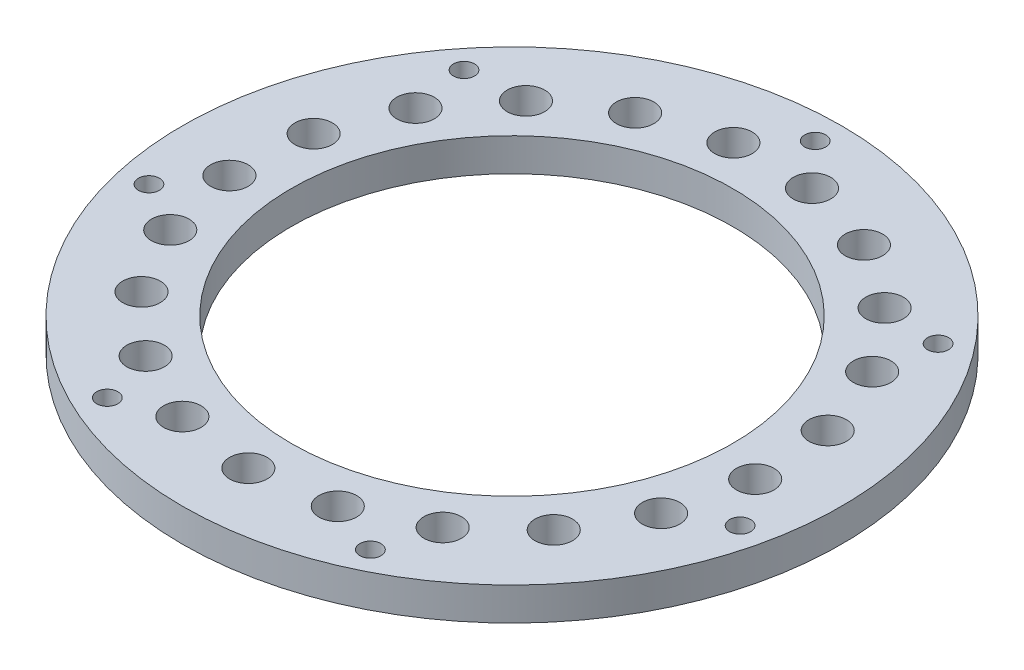
ISO-10303-21;
HEADER;
FILE_DESCRIPTION(('STEP AP214'),'2;1');
FILE_NAME('part.step','',(''),(''),'','','');
FILE_SCHEMA(('AUTOMOTIVE_DESIGN { 1 0 10303 214 1 1 1 1 }'));
ENDSEC;
DATA;
#1=APPLICATION_CONTEXT('core data for automotive mechanical design processes');
#2=APPLICATION_PROTOCOL_DEFINITION('international standard','automotive_design',2000,#1);
#3=PRODUCT_CONTEXT('',#1,'mechanical');
#4=PRODUCT('Part','Part','',(#3));
#5=PRODUCT_RELATED_PRODUCT_CATEGORY('part','',(#4));
#6=PRODUCT_DEFINITION_FORMATION('','',#4);
#7=PRODUCT_DEFINITION_CONTEXT('part definition',#1,'design');
#8=PRODUCT_DEFINITION('design','',#6,#7);
#9=PRODUCT_DEFINITION_SHAPE('','',#8);
#10=(LENGTH_UNIT() NAMED_UNIT(*) SI_UNIT(.MILLI.,.METRE.));
#11=(NAMED_UNIT(*) PLANE_ANGLE_UNIT() SI_UNIT($,.RADIAN.));
#12=(NAMED_UNIT(*) SI_UNIT($,.STERADIAN.) SOLID_ANGLE_UNIT());
#13=UNCERTAINTY_MEASURE_WITH_UNIT(LENGTH_MEASURE(1.E-05),#10,'distance_accuracy_value','');
#14=(GEOMETRIC_REPRESENTATION_CONTEXT(3) GLOBAL_UNCERTAINTY_ASSIGNED_CONTEXT((#13)) GLOBAL_UNIT_ASSIGNED_CONTEXT((#10,
#11,#12)) REPRESENTATION_CONTEXT('',''));
#15=CARTESIAN_POINT('',(0.,0.,0.));
#16=DIRECTION('',(0.,0.,1.));
#17=DIRECTION('',(1.,0.,0.));
#18=AXIS2_PLACEMENT_3D('',#15,#16,#17);
#19=CARTESIAN_POINT('',(0.,5.,0.));
#20=DIRECTION('',(0.,1.,0.));
#21=DIRECTION('',(0.,0.,1.));
#22=AXIS2_PLACEMENT_3D('',#19,#20,#21);
#23=PLANE('',#22);
#24=CARTESIAN_POINT('',(-11.7902069764356,5.,38.2229122314458));
#25=DIRECTION('',(0.,1.,0.));
#26=DIRECTION('',(0.,0.,1.));
#27=AXIS2_PLACEMENT_3D('',#24,#25,#26);
#28=CIRCLE('',#27,2.85);
#29=CARTESIAN_POINT('',(-11.7902069764356,5.,41.0729122314458));
#30=VERTEX_POINT('',#29);
#31=EDGE_CURVE('E222',#30,#30,#28,.T.);
#32=ORIENTED_EDGE('',*,*,#31,.F.);
#33=EDGE_LOOP('',(#32));
#34=FACE_BOUND('',#33,.T.);
#35=CARTESIAN_POINT('',(-22.5328023225445,5.,33.0495509726401));
#36=DIRECTION('',(0.,1.,0.));
#37=DIRECTION('',(0.,0.,1.));
#38=AXIS2_PLACEMENT_3D('',#35,#36,#37);
#39=CIRCLE('',#38,2.85);
#40=CARTESIAN_POINT('',(-22.5328023225445,5.,35.8995509726401));
#41=VERTEX_POINT('',#40);
#42=EDGE_CURVE('E216',#41,#41,#39,.T.);
#43=ORIENTED_EDGE('',*,*,#42,.F.);
#44=EDGE_LOOP('',(#43));
#45=FACE_BOUND('',#44,.T.);
#46=CARTESIAN_POINT('',(-31.2732592987209,5.,24.9395920743497));
#47=DIRECTION('',(0.,1.,0.));
#48=DIRECTION('',(0.,0.,1.));
#49=AXIS2_PLACEMENT_3D('',#46,#47,#48);
#50=CIRCLE('',#49,2.85);
#51=CARTESIAN_POINT('',(-31.2732592987209,5.,27.7895920743497));
#52=VERTEX_POINT('',#51);
#53=EDGE_CURVE('E210',#52,#52,#50,.T.);
#54=ORIENTED_EDGE('',*,*,#53,.F.);
#55=EDGE_LOOP('',(#54));
#56=FACE_BOUND('',#55,.T.);
#57=CARTESIAN_POINT('',(-37.234949945768,5.,14.6136409746562));
#58=DIRECTION('',(0.,1.,0.));
#59=DIRECTION('',(0.,0.,1.));
#60=AXIS2_PLACEMENT_3D('',#57,#58,#59);
#61=CIRCLE('',#60,2.85);
#62=CARTESIAN_POINT('',(-37.234949945768,5.,17.4636409746562));
#63=VERTEX_POINT('',#62);
#64=EDGE_CURVE('E204',#63,#63,#61,.T.);
#65=ORIENTED_EDGE('',*,*,#64,.F.);
#66=EDGE_LOOP('',(#65));
#67=FACE_BOUND('',#66,.T.);
#68=CARTESIAN_POINT('',(-39.8881518872472,5.,2.9892037434574));
#69=DIRECTION('',(0.,1.,0.));
#70=DIRECTION('',(0.,0.,1.));
#71=AXIS2_PLACEMENT_3D('',#68,#69,#70);
#72=CIRCLE('',#71,2.85);
#73=CARTESIAN_POINT('',(-39.8881518872472,5.,5.8392037434574));
#74=VERTEX_POINT('',#73);
#75=EDGE_CURVE('E198',#74,#74,#72,.T.);
#76=ORIENTED_EDGE('',*,*,#75,.F.);
#77=EDGE_LOOP('',(#76));
#78=FACE_BOUND('',#77,.T.);
#79=CARTESIAN_POINT('',(-38.997116487273,5.,-8.90083735825217));
#80=DIRECTION('',(0.,1.,0.));
#81=DIRECTION('',(0.,0.,1.));
#82=AXIS2_PLACEMENT_3D('',#79,#80,#81);
#83=CIRCLE('',#82,2.85);
#84=CARTESIAN_POINT('',(-38.997116487273,5.,-6.05083735825217));
#85=VERTEX_POINT('',#84);
#86=EDGE_CURVE('E192',#85,#85,#83,.T.);
#87=ORIENTED_EDGE('',*,*,#86,.F.);
#88=EDGE_LOOP('',(#87));
#89=FACE_BOUND('',#88,.T.);
#90=CARTESIAN_POINT('',(-34.6410161513777,5.,-19.9999999999997));
#91=DIRECTION('',(0.,1.,0.));
#92=DIRECTION('',(0.,0.,1.));
#93=AXIS2_PLACEMENT_3D('',#90,#91,#92);
#94=CIRCLE('',#93,2.85);
#95=CARTESIAN_POINT('',(-34.6410161513777,5.,-17.1499999999997));
#96=VERTEX_POINT('',#95);
#97=EDGE_CURVE('E186',#96,#96,#94,.T.);
#98=ORIENTED_EDGE('',*,*,#97,.F.);
#99=EDGE_LOOP('',(#98));
#100=FACE_BOUND('',#99,.T.);
#101=CARTESIAN_POINT('',(-27.206909510837,5.,-29.3220748731928));
#102=DIRECTION('',(0.,1.,0.));
#103=DIRECTION('',(0.,0.,1.));
#104=AXIS2_PLACEMENT_3D('',#101,#102,#103);
#105=CIRCLE('',#104,2.85);
#106=CARTESIAN_POINT('',(-27.206909510837,5.,-26.4720748731928));
#107=VERTEX_POINT('',#106);
#108=EDGE_CURVE('E180',#107,#107,#105,.T.);
#109=ORIENTED_EDGE('',*,*,#108,.F.);
#110=EDGE_LOOP('',(#109));
#111=FACE_BOUND('',#110,.T.);
#112=CARTESIAN_POINT('',(-17.3553495647026,5.,-36.0387547160966));
#113=DIRECTION('',(0.,1.,0.));
#114=DIRECTION('',(0.,0.,1.));
#115=AXIS2_PLACEMENT_3D('',#112,#113,#114);
#116=CIRCLE('',#115,2.85);
#117=CARTESIAN_POINT('',(-17.3553495647026,5.,-33.1887547160966));
#118=VERTEX_POINT('',#117);
#119=EDGE_CURVE('E174',#118,#118,#116,.T.);
#120=ORIENTED_EDGE('',*,*,#119,.F.);
#121=EDGE_LOOP('',(#120));
#122=FACE_BOUND('',#121,.T.);
#123=CARTESIAN_POINT('',(-5.96169064704728,5.,-39.5532330490051));
#124=DIRECTION('',(0.,1.,0.));
#125=DIRECTION('',(0.,0.,1.));
#126=AXIS2_PLACEMENT_3D('',#123,#124,#125);
#127=CIRCLE('',#126,2.85);
#128=CARTESIAN_POINT('',(-5.96169064704728,5.,-36.7032330490051));
#129=VERTEX_POINT('',#128);
#130=EDGE_CURVE('E168',#129,#129,#127,.T.);
#131=ORIENTED_EDGE('',*,*,#130,.F.);
#132=EDGE_LOOP('',(#131));
#133=FACE_BOUND('',#132,.T.);
#134=CARTESIAN_POINT('',(5.96169064704671,5.,-39.5532330490052));
#135=DIRECTION('',(0.,1.,0.));
#136=DIRECTION('',(0.,0.,1.));
#137=AXIS2_PLACEMENT_3D('',#134,#135,#136);
#138=CIRCLE('',#137,2.85);
#139=CARTESIAN_POINT('',(5.96169064704671,5.,-36.7032330490052));
#140=VERTEX_POINT('',#139);
#141=EDGE_CURVE('E162',#140,#140,#138,.T.);
#142=ORIENTED_EDGE('',*,*,#141,.F.);
#143=EDGE_LOOP('',(#142));
#144=FACE_BOUND('',#143,.T.);
#145=CARTESIAN_POINT('',(17.3553495647021,5.,-36.0387547160969));
#146=DIRECTION('',(0.,1.,0.));
#147=DIRECTION('',(0.,0.,1.));
#148=AXIS2_PLACEMENT_3D('',#145,#146,#147);
#149=CIRCLE('',#148,2.85);
#150=CARTESIAN_POINT('',(17.3553495647021,5.,-33.1887547160969));
#151=VERTEX_POINT('',#150);
#152=EDGE_CURVE('E156',#151,#151,#149,.T.);
#153=ORIENTED_EDGE('',*,*,#152,.F.);
#154=EDGE_LOOP('',(#153));
#155=FACE_BOUND('',#154,.T.);
#156=CARTESIAN_POINT('',(27.2069095108366,5.,-29.3220748731932));
#157=DIRECTION('',(0.,1.,0.));
#158=DIRECTION('',(0.,0.,1.));
#159=AXIS2_PLACEMENT_3D('',#156,#157,#158);
#160=CIRCLE('',#159,2.85);
#161=CARTESIAN_POINT('',(27.2069095108366,5.,-26.4720748731932));
#162=VERTEX_POINT('',#161);
#163=EDGE_CURVE('E150',#162,#162,#160,.T.);
#164=ORIENTED_EDGE('',*,*,#163,.F.);
#165=EDGE_LOOP('',(#164));
#166=FACE_BOUND('',#165,.T.);
#167=CARTESIAN_POINT('',(34.6410161513775,5.,-20.0000000000002));
#168=DIRECTION('',(0.,1.,0.));
#169=DIRECTION('',(0.,0.,1.));
#170=AXIS2_PLACEMENT_3D('',#167,#168,#169);
#171=CIRCLE('',#170,2.85);
#172=CARTESIAN_POINT('',(34.6410161513775,5.,-17.1500000000002));
#173=VERTEX_POINT('',#172);
#174=EDGE_CURVE('E144',#173,#173,#171,.T.);
#175=ORIENTED_EDGE('',*,*,#174,.F.);
#176=EDGE_LOOP('',(#175));
#177=FACE_BOUND('',#176,.T.);
#178=CARTESIAN_POINT('',(38.9971164872729,5.,-8.90083735825273));
#179=DIRECTION('',(0.,1.,0.));
#180=DIRECTION('',(0.,0.,1.));
#181=AXIS2_PLACEMENT_3D('',#178,#179,#180);
#182=CIRCLE('',#181,2.85);
#183=CARTESIAN_POINT('',(38.9971164872729,5.,-6.05083735825273));
#184=VERTEX_POINT('',#183);
#185=EDGE_CURVE('E138',#184,#184,#182,.T.);
#186=ORIENTED_EDGE('',*,*,#185,.F.);
#187=EDGE_LOOP('',(#186));
#188=FACE_BOUND('',#187,.T.);
#189=CARTESIAN_POINT('',(39.8881518872472,5.,2.98920374345683));
#190=DIRECTION('',(0.,1.,0.));
#191=DIRECTION('',(0.,0.,1.));
#192=AXIS2_PLACEMENT_3D('',#189,#190,#191);
#193=CIRCLE('',#192,2.85);
#194=CARTESIAN_POINT('',(39.8881518872472,5.,5.83920374345683));
#195=VERTEX_POINT('',#194);
#196=EDGE_CURVE('E132',#195,#195,#193,.T.);
#197=ORIENTED_EDGE('',*,*,#196,.F.);
#198=EDGE_LOOP('',(#197));
#199=FACE_BOUND('',#198,.T.);
#200=CARTESIAN_POINT('',(37.2349499457682,5.,14.6136409746557));
#201=DIRECTION('',(0.,1.,0.));
#202=DIRECTION('',(0.,0.,1.));
#203=AXIS2_PLACEMENT_3D('',#200,#201,#202);
#204=CIRCLE('',#203,2.85);
#205=CARTESIAN_POINT('',(37.2349499457682,5.,17.4636409746557));
#206=VERTEX_POINT('',#205);
#207=EDGE_CURVE('E126',#206,#206,#204,.T.);
#208=ORIENTED_EDGE('',*,*,#207,.F.);
#209=EDGE_LOOP('',(#208));
#210=FACE_BOUND('',#209,.T.);
#211=CARTESIAN_POINT('',(31.2732592987212,5.,24.9395920743493));
#212=DIRECTION('',(0.,1.,0.));
#213=DIRECTION('',(0.,0.,1.));
#214=AXIS2_PLACEMENT_3D('',#211,#212,#213);
#215=CIRCLE('',#214,2.85);
#216=CARTESIAN_POINT('',(31.2732592987212,5.,27.7895920743493));
#217=VERTEX_POINT('',#216);
#218=EDGE_CURVE('E120',#217,#217,#215,.T.);
#219=ORIENTED_EDGE('',*,*,#218,.F.);
#220=EDGE_LOOP('',(#219));
#221=FACE_BOUND('',#220,.T.);
#222=CARTESIAN_POINT('',(22.5328023225449,5.,33.0495509726398));
#223=DIRECTION('',(0.,1.,0.));
#224=DIRECTION('',(0.,0.,1.));
#225=AXIS2_PLACEMENT_3D('',#222,#223,#224);
#226=CIRCLE('',#225,2.85);
#227=CARTESIAN_POINT('',(22.5328023225449,5.,35.8995509726398));
#228=VERTEX_POINT('',#227);
#229=EDGE_CURVE('E114',#228,#228,#226,.T.);
#230=ORIENTED_EDGE('',*,*,#229,.F.);
#231=EDGE_LOOP('',(#230));
#232=FACE_BOUND('',#231,.T.);
#233=CARTESIAN_POINT('',(11.7902069764362,5.,38.2229122314456));
#234=DIRECTION('',(0.,1.,0.));
#235=DIRECTION('',(0.,0.,1.));
#236=AXIS2_PLACEMENT_3D('',#233,#234,#235);
#237=CIRCLE('',#236,2.85);
#238=CARTESIAN_POINT('',(11.7902069764362,5.,41.0729122314456));
#239=VERTEX_POINT('',#238);
#240=EDGE_CURVE('E108',#239,#239,#237,.T.);
#241=ORIENTED_EDGE('',*,*,#240,.F.);
#242=EDGE_LOOP('',(#241));
#243=FACE_BOUND('',#242,.T.);
#244=CARTESIAN_POINT('',(0.,5.,40.));
#245=DIRECTION('',(0.,1.,0.));
#246=DIRECTION('',(0.,0.,1.));
#247=AXIS2_PLACEMENT_3D('',#244,#245,#246);
#248=CIRCLE('',#247,2.85);
#249=CARTESIAN_POINT('',(0.,5.,42.85));
#250=VERTEX_POINT('',#249);
#251=EDGE_CURVE('E102',#250,#250,#248,.T.);
#252=ORIENTED_EDGE('',*,*,#251,.F.);
#253=EDGE_LOOP('',(#252));
#254=FACE_BOUND('',#253,.T.);
#255=CARTESIAN_POINT('',(35.964248193529,5.,-28.6805308855022));
#256=DIRECTION('',(0.,1.,0.));
#257=DIRECTION('',(0.,0.,1.));
#258=AXIS2_PLACEMENT_3D('',#255,#256,#257);
#259=CIRCLE('',#258,1.59999999999999);
#260=CARTESIAN_POINT('',(35.964248193529,5.,-27.0805308855022));
#261=VERTEX_POINT('',#260);
#262=EDGE_CURVE('E96',#261,#261,#259,.T.);
#263=ORIENTED_EDGE('',*,*,#262,.F.);
#264=EDGE_LOOP('',(#263));
#265=FACE_BOUND('',#264,.T.);
#266=CARTESIAN_POINT('',(44.846683960364,5.,10.23596296199));
#267=DIRECTION('',(0.,1.,0.));
#268=DIRECTION('',(0.,0.,1.));
#269=AXIS2_PLACEMENT_3D('',#266,#267,#268);
#270=CIRCLE('',#269,1.59999999999999);
#271=CARTESIAN_POINT('',(44.846683960364,5.,11.83596296199));
#272=VERTEX_POINT('',#271);
#273=EDGE_CURVE('E90',#272,#272,#270,.T.);
#274=ORIENTED_EDGE('',*,*,#273,.F.);
#275=EDGE_LOOP('',(#274));
#276=FACE_BOUND('',#275,.T.);
#277=CARTESIAN_POINT('',(19.958651999408,5.,41.4445679235111));
#278=DIRECTION('',(0.,1.,0.));
#279=DIRECTION('',(0.,0.,1.));
#280=AXIS2_PLACEMENT_3D('',#277,#278,#279);
#281=CIRCLE('',#280,1.59999999999999);
#282=CARTESIAN_POINT('',(19.958651999408,5.,43.0445679235111));
#283=VERTEX_POINT('',#282);
#284=EDGE_CURVE('E84',#283,#283,#281,.T.);
#285=ORIENTED_EDGE('',*,*,#284,.F.);
#286=EDGE_LOOP('',(#285));
#287=FACE_BOUND('',#286,.T.);
#288=CARTESIAN_POINT('',(-19.9586519994074,5.,41.4445679235114));
#289=DIRECTION('',(0.,1.,0.));
#290=DIRECTION('',(0.,0.,1.));
#291=AXIS2_PLACEMENT_3D('',#288,#289,#290);
#292=CIRCLE('',#291,1.59999999999999);
#293=CARTESIAN_POINT('',(-19.9586519994074,5.,43.0445679235114));
#294=VERTEX_POINT('',#293);
#295=EDGE_CURVE('E78',#294,#294,#292,.T.);
#296=ORIENTED_EDGE('',*,*,#295,.F.);
#297=EDGE_LOOP('',(#296));
#298=FACE_BOUND('',#297,.T.);
#299=CARTESIAN_POINT('',(-44.8466839603638,5.,10.2359629619906));
#300=DIRECTION('',(0.,1.,0.));
#301=DIRECTION('',(0.,0.,1.));
#302=AXIS2_PLACEMENT_3D('',#299,#300,#301);
#303=CIRCLE('',#302,1.59999999999999);
#304=CARTESIAN_POINT('',(-44.8466839603638,5.,11.8359629619906));
#305=VERTEX_POINT('',#304);
#306=EDGE_CURVE('E72',#305,#305,#303,.T.);
#307=ORIENTED_EDGE('',*,*,#306,.F.);
#308=EDGE_LOOP('',(#307));
#309=FACE_BOUND('',#308,.T.);
#310=CARTESIAN_POINT('',(-35.9642481935294,5.,-28.6805308855017));
#311=DIRECTION('',(0.,1.,0.));
#312=DIRECTION('',(0.,0.,1.));
#313=AXIS2_PLACEMENT_3D('',#310,#311,#312);
#314=CIRCLE('',#313,1.59999999999998);
#315=CARTESIAN_POINT('',(-35.9642481935294,5.,-27.0805308855017));
#316=VERTEX_POINT('',#315);
#317=EDGE_CURVE('E66',#316,#316,#314,.T.);
#318=ORIENTED_EDGE('',*,*,#317,.F.);
#319=EDGE_LOOP('',(#318));
#320=FACE_BOUND('',#319,.T.);
#321=CARTESIAN_POINT('',(0.,5.,-46.));
#322=DIRECTION('',(0.,1.,0.));
#323=DIRECTION('',(0.,0.,1.));
#324=AXIS2_PLACEMENT_3D('',#321,#322,#323);
#325=CIRCLE('',#324,1.59999999999999);
#326=CARTESIAN_POINT('',(0.,5.,-44.4));
#327=VERTEX_POINT('',#326);
#328=EDGE_CURVE('E60',#327,#327,#325,.T.);
#329=ORIENTED_EDGE('',*,*,#328,.F.);
#330=EDGE_LOOP('',(#329));
#331=FACE_BOUND('',#330,.T.);
#332=CARTESIAN_POINT('',(0.,5.,0.));
#333=DIRECTION('',(0.,1.,0.));
#334=DIRECTION('',(0.,0.,1.));
#335=AXIS2_PLACEMENT_3D('',#332,#333,#334);
#336=CIRCLE('',#335,50.);
#337=CARTESIAN_POINT('',(0.,5.,50.));
#338=VERTEX_POINT('',#337);
#339=EDGE_CURVE('E10',#338,#338,#336,.T.);
#340=ORIENTED_EDGE('',*,*,#339,.T.);
#341=EDGE_LOOP('',(#340));
#342=FACE_BOUND('',#341,.T.);
#343=CARTESIAN_POINT('',(0.,5.,0.));
#344=DIRECTION('',(0.,1.,0.));
#345=DIRECTION('',(0.,0.,1.));
#346=AXIS2_PLACEMENT_3D('',#343,#344,#345);
#347=CIRCLE('',#346,33.5);
#348=CARTESIAN_POINT('',(0.,5.,33.5));
#349=VERTEX_POINT('',#348);
#350=EDGE_CURVE('E50',#349,#349,#347,.T.);
#351=ORIENTED_EDGE('',*,*,#350,.F.);
#352=EDGE_LOOP('',(#351));
#353=FACE_BOUND('',#352,.T.);
#354=ADVANCED_FACE('F39',(#34,#45,#56,#67,#78,#89,#100,#111,#122,#133,#144,#155,#166,#177,#188,
#199,#210,#221,#232,#243,#254,#265,#276,#287,#298,#309,#320,#331,#342,#353),#23,.T.);
#355=CARTESIAN_POINT('',(0.,0.,0.));
#356=DIRECTION('',(0.,1.,0.));
#357=DIRECTION('',(0.,0.,1.));
#358=AXIS2_PLACEMENT_3D('',#355,#356,#357);
#359=PLANE('',#358);
#360=CARTESIAN_POINT('',(-11.7902069764356,0.,38.2229122314458));
#361=DIRECTION('',(0.,1.,0.));
#362=DIRECTION('',(0.,0.,1.));
#363=AXIS2_PLACEMENT_3D('',#360,#361,#362);
#364=CIRCLE('',#363,2.85);
#365=CARTESIAN_POINT('',(-11.7902069764356,0.,41.0729122314458));
#366=VERTEX_POINT('',#365);
#367=EDGE_CURVE('E219',#366,#366,#364,.T.);
#368=ORIENTED_EDGE('',*,*,#367,.T.);
#369=EDGE_LOOP('',(#368));
#370=FACE_BOUND('',#369,.T.);
#371=CARTESIAN_POINT('',(-22.5328023225445,0.,33.0495509726401));
#372=DIRECTION('',(0.,1.,0.));
#373=DIRECTION('',(0.,0.,1.));
#374=AXIS2_PLACEMENT_3D('',#371,#372,#373);
#375=CIRCLE('',#374,2.85);
#376=CARTESIAN_POINT('',(-22.5328023225445,0.,35.8995509726401));
#377=VERTEX_POINT('',#376);
#378=EDGE_CURVE('E213',#377,#377,#375,.T.);
#379=ORIENTED_EDGE('',*,*,#378,.T.);
#380=EDGE_LOOP('',(#379));
#381=FACE_BOUND('',#380,.T.);
#382=CARTESIAN_POINT('',(-31.2732592987209,0.,24.9395920743497));
#383=DIRECTION('',(0.,1.,0.));
#384=DIRECTION('',(0.,0.,1.));
#385=AXIS2_PLACEMENT_3D('',#382,#383,#384);
#386=CIRCLE('',#385,2.85);
#387=CARTESIAN_POINT('',(-31.2732592987209,0.,27.7895920743497));
#388=VERTEX_POINT('',#387);
#389=EDGE_CURVE('E207',#388,#388,#386,.T.);
#390=ORIENTED_EDGE('',*,*,#389,.T.);
#391=EDGE_LOOP('',(#390));
#392=FACE_BOUND('',#391,.T.);
#393=CARTESIAN_POINT('',(-37.234949945768,0.,14.6136409746562));
#394=DIRECTION('',(0.,1.,0.));
#395=DIRECTION('',(0.,0.,1.));
#396=AXIS2_PLACEMENT_3D('',#393,#394,#395);
#397=CIRCLE('',#396,2.85);
#398=CARTESIAN_POINT('',(-37.234949945768,0.,17.4636409746562));
#399=VERTEX_POINT('',#398);
#400=EDGE_CURVE('E201',#399,#399,#397,.T.);
#401=ORIENTED_EDGE('',*,*,#400,.T.);
#402=EDGE_LOOP('',(#401));
#403=FACE_BOUND('',#402,.T.);
#404=CARTESIAN_POINT('',(-39.8881518872472,0.,2.9892037434574));
#405=DIRECTION('',(0.,1.,0.));
#406=DIRECTION('',(0.,0.,1.));
#407=AXIS2_PLACEMENT_3D('',#404,#405,#406);
#408=CIRCLE('',#407,2.85);
#409=CARTESIAN_POINT('',(-39.8881518872472,0.,5.8392037434574));
#410=VERTEX_POINT('',#409);
#411=EDGE_CURVE('E195',#410,#410,#408,.T.);
#412=ORIENTED_EDGE('',*,*,#411,.T.);
#413=EDGE_LOOP('',(#412));
#414=FACE_BOUND('',#413,.T.);
#415=CARTESIAN_POINT('',(-38.997116487273,0.,-8.90083735825217));
#416=DIRECTION('',(0.,1.,0.));
#417=DIRECTION('',(0.,0.,1.));
#418=AXIS2_PLACEMENT_3D('',#415,#416,#417);
#419=CIRCLE('',#418,2.85);
#420=CARTESIAN_POINT('',(-38.997116487273,0.,-6.05083735825217));
#421=VERTEX_POINT('',#420);
#422=EDGE_CURVE('E189',#421,#421,#419,.T.);
#423=ORIENTED_EDGE('',*,*,#422,.T.);
#424=EDGE_LOOP('',(#423));
#425=FACE_BOUND('',#424,.T.);
#426=CARTESIAN_POINT('',(-34.6410161513777,0.,-19.9999999999997));
#427=DIRECTION('',(0.,1.,0.));
#428=DIRECTION('',(0.,0.,1.));
#429=AXIS2_PLACEMENT_3D('',#426,#427,#428);
#430=CIRCLE('',#429,2.85);
#431=CARTESIAN_POINT('',(-34.6410161513777,0.,-17.1499999999997));
#432=VERTEX_POINT('',#431);
#433=EDGE_CURVE('E183',#432,#432,#430,.T.);
#434=ORIENTED_EDGE('',*,*,#433,.T.);
#435=EDGE_LOOP('',(#434));
#436=FACE_BOUND('',#435,.T.);
#437=CARTESIAN_POINT('',(-27.206909510837,0.,-29.3220748731928));
#438=DIRECTION('',(0.,1.,0.));
#439=DIRECTION('',(0.,0.,1.));
#440=AXIS2_PLACEMENT_3D('',#437,#438,#439);
#441=CIRCLE('',#440,2.85);
#442=CARTESIAN_POINT('',(-27.206909510837,0.,-26.4720748731928));
#443=VERTEX_POINT('',#442);
#444=EDGE_CURVE('E177',#443,#443,#441,.T.);
#445=ORIENTED_EDGE('',*,*,#444,.T.);
#446=EDGE_LOOP('',(#445));
#447=FACE_BOUND('',#446,.T.);
#448=CARTESIAN_POINT('',(-17.3553495647026,0.,-36.0387547160966));
#449=DIRECTION('',(0.,1.,0.));
#450=DIRECTION('',(0.,0.,1.));
#451=AXIS2_PLACEMENT_3D('',#448,#449,#450);
#452=CIRCLE('',#451,2.85);
#453=CARTESIAN_POINT('',(-17.3553495647026,0.,-33.1887547160966));
#454=VERTEX_POINT('',#453);
#455=EDGE_CURVE('E171',#454,#454,#452,.T.);
#456=ORIENTED_EDGE('',*,*,#455,.T.);
#457=EDGE_LOOP('',(#456));
#458=FACE_BOUND('',#457,.T.);
#459=CARTESIAN_POINT('',(-5.96169064704728,0.,-39.5532330490051));
#460=DIRECTION('',(0.,1.,0.));
#461=DIRECTION('',(0.,0.,1.));
#462=AXIS2_PLACEMENT_3D('',#459,#460,#461);
#463=CIRCLE('',#462,2.85);
#464=CARTESIAN_POINT('',(-5.96169064704728,0.,-36.7032330490051));
#465=VERTEX_POINT('',#464);
#466=EDGE_CURVE('E165',#465,#465,#463,.T.);
#467=ORIENTED_EDGE('',*,*,#466,.T.);
#468=EDGE_LOOP('',(#467));
#469=FACE_BOUND('',#468,.T.);
#470=CARTESIAN_POINT('',(5.96169064704671,0.,-39.5532330490052));
#471=DIRECTION('',(0.,1.,0.));
#472=DIRECTION('',(0.,0.,1.));
#473=AXIS2_PLACEMENT_3D('',#470,#471,#472);
#474=CIRCLE('',#473,2.85);
#475=CARTESIAN_POINT('',(5.96169064704671,0.,-36.7032330490052));
#476=VERTEX_POINT('',#475);
#477=EDGE_CURVE('E159',#476,#476,#474,.T.);
#478=ORIENTED_EDGE('',*,*,#477,.T.);
#479=EDGE_LOOP('',(#478));
#480=FACE_BOUND('',#479,.T.);
#481=CARTESIAN_POINT('',(17.3553495647021,0.,-36.0387547160969));
#482=DIRECTION('',(0.,1.,0.));
#483=DIRECTION('',(0.,0.,1.));
#484=AXIS2_PLACEMENT_3D('',#481,#482,#483);
#485=CIRCLE('',#484,2.85);
#486=CARTESIAN_POINT('',(17.3553495647021,0.,-33.1887547160969));
#487=VERTEX_POINT('',#486);
#488=EDGE_CURVE('E153',#487,#487,#485,.T.);
#489=ORIENTED_EDGE('',*,*,#488,.T.);
#490=EDGE_LOOP('',(#489));
#491=FACE_BOUND('',#490,.T.);
#492=CARTESIAN_POINT('',(27.2069095108366,0.,-29.3220748731932));
#493=DIRECTION('',(0.,1.,0.));
#494=DIRECTION('',(0.,0.,1.));
#495=AXIS2_PLACEMENT_3D('',#492,#493,#494);
#496=CIRCLE('',#495,2.85);
#497=CARTESIAN_POINT('',(27.2069095108366,0.,-26.4720748731932));
#498=VERTEX_POINT('',#497);
#499=EDGE_CURVE('E147',#498,#498,#496,.T.);
#500=ORIENTED_EDGE('',*,*,#499,.T.);
#501=EDGE_LOOP('',(#500));
#502=FACE_BOUND('',#501,.T.);
#503=CARTESIAN_POINT('',(34.6410161513775,0.,-20.0000000000002));
#504=DIRECTION('',(0.,1.,0.));
#505=DIRECTION('',(0.,0.,1.));
#506=AXIS2_PLACEMENT_3D('',#503,#504,#505);
#507=CIRCLE('',#506,2.85);
#508=CARTESIAN_POINT('',(34.6410161513775,0.,-17.1500000000002));
#509=VERTEX_POINT('',#508);
#510=EDGE_CURVE('E141',#509,#509,#507,.T.);
#511=ORIENTED_EDGE('',*,*,#510,.T.);
#512=EDGE_LOOP('',(#511));
#513=FACE_BOUND('',#512,.T.);
#514=CARTESIAN_POINT('',(38.9971164872729,0.,-8.90083735825273));
#515=DIRECTION('',(0.,1.,0.));
#516=DIRECTION('',(0.,0.,1.));
#517=AXIS2_PLACEMENT_3D('',#514,#515,#516);
#518=CIRCLE('',#517,2.85);
#519=CARTESIAN_POINT('',(38.9971164872729,0.,-6.05083735825273));
#520=VERTEX_POINT('',#519);
#521=EDGE_CURVE('E135',#520,#520,#518,.T.);
#522=ORIENTED_EDGE('',*,*,#521,.T.);
#523=EDGE_LOOP('',(#522));
#524=FACE_BOUND('',#523,.T.);
#525=CARTESIAN_POINT('',(39.8881518872472,0.,2.98920374345683));
#526=DIRECTION('',(0.,1.,0.));
#527=DIRECTION('',(0.,0.,1.));
#528=AXIS2_PLACEMENT_3D('',#525,#526,#527);
#529=CIRCLE('',#528,2.85);
#530=CARTESIAN_POINT('',(39.8881518872472,0.,5.83920374345683));
#531=VERTEX_POINT('',#530);
#532=EDGE_CURVE('E129',#531,#531,#529,.T.);
#533=ORIENTED_EDGE('',*,*,#532,.T.);
#534=EDGE_LOOP('',(#533));
#535=FACE_BOUND('',#534,.T.);
#536=CARTESIAN_POINT('',(37.2349499457682,0.,14.6136409746557));
#537=DIRECTION('',(0.,1.,0.));
#538=DIRECTION('',(0.,0.,1.));
#539=AXIS2_PLACEMENT_3D('',#536,#537,#538);
#540=CIRCLE('',#539,2.85);
#541=CARTESIAN_POINT('',(37.2349499457682,0.,17.4636409746557));
#542=VERTEX_POINT('',#541);
#543=EDGE_CURVE('E123',#542,#542,#540,.T.);
#544=ORIENTED_EDGE('',*,*,#543,.T.);
#545=EDGE_LOOP('',(#544));
#546=FACE_BOUND('',#545,.T.);
#547=CARTESIAN_POINT('',(31.2732592987212,0.,24.9395920743493));
#548=DIRECTION('',(0.,1.,0.));
#549=DIRECTION('',(0.,0.,1.));
#550=AXIS2_PLACEMENT_3D('',#547,#548,#549);
#551=CIRCLE('',#550,2.85);
#552=CARTESIAN_POINT('',(31.2732592987212,0.,27.7895920743493));
#553=VERTEX_POINT('',#552);
#554=EDGE_CURVE('E117',#553,#553,#551,.T.);
#555=ORIENTED_EDGE('',*,*,#554,.T.);
#556=EDGE_LOOP('',(#555));
#557=FACE_BOUND('',#556,.T.);
#558=CARTESIAN_POINT('',(22.5328023225449,0.,33.0495509726398));
#559=DIRECTION('',(0.,1.,0.));
#560=DIRECTION('',(0.,0.,1.));
#561=AXIS2_PLACEMENT_3D('',#558,#559,#560);
#562=CIRCLE('',#561,2.85);
#563=CARTESIAN_POINT('',(22.5328023225449,0.,35.8995509726398));
#564=VERTEX_POINT('',#563);
#565=EDGE_CURVE('E111',#564,#564,#562,.T.);
#566=ORIENTED_EDGE('',*,*,#565,.T.);
#567=EDGE_LOOP('',(#566));
#568=FACE_BOUND('',#567,.T.);
#569=CARTESIAN_POINT('',(11.7902069764362,0.,38.2229122314456));
#570=DIRECTION('',(0.,1.,0.));
#571=DIRECTION('',(0.,0.,1.));
#572=AXIS2_PLACEMENT_3D('',#569,#570,#571);
#573=CIRCLE('',#572,2.85);
#574=CARTESIAN_POINT('',(11.7902069764362,0.,41.0729122314456));
#575=VERTEX_POINT('',#574);
#576=EDGE_CURVE('E105',#575,#575,#573,.T.);
#577=ORIENTED_EDGE('',*,*,#576,.T.);
#578=EDGE_LOOP('',(#577));
#579=FACE_BOUND('',#578,.T.);
#580=CARTESIAN_POINT('',(0.,0.,40.));
#581=DIRECTION('',(0.,1.,0.));
#582=DIRECTION('',(0.,0.,1.));
#583=AXIS2_PLACEMENT_3D('',#580,#581,#582);
#584=CIRCLE('',#583,2.85);
#585=CARTESIAN_POINT('',(0.,0.,42.85));
#586=VERTEX_POINT('',#585);
#587=EDGE_CURVE('E99',#586,#586,#584,.T.);
#588=ORIENTED_EDGE('',*,*,#587,.T.);
#589=EDGE_LOOP('',(#588));
#590=FACE_BOUND('',#589,.T.);
#591=CARTESIAN_POINT('',(35.964248193529,0.,-28.6805308855022));
#592=DIRECTION('',(0.,1.,0.));
#593=DIRECTION('',(0.,0.,1.));
#594=AXIS2_PLACEMENT_3D('',#591,#592,#593);
#595=CIRCLE('',#594,1.6);
#596=CARTESIAN_POINT('',(35.964248193529,0.,-27.0805308855022));
#597=VERTEX_POINT('',#596);
#598=EDGE_CURVE('E93',#597,#597,#595,.T.);
#599=ORIENTED_EDGE('',*,*,#598,.T.);
#600=EDGE_LOOP('',(#599));
#601=FACE_BOUND('',#600,.T.);
#602=CARTESIAN_POINT('',(44.846683960364,0.,10.23596296199));
#603=DIRECTION('',(0.,1.,0.));
#604=DIRECTION('',(0.,0.,1.));
#605=AXIS2_PLACEMENT_3D('',#602,#603,#604);
#606=CIRCLE('',#605,1.6);
#607=CARTESIAN_POINT('',(44.846683960364,0.,11.83596296199));
#608=VERTEX_POINT('',#607);
#609=EDGE_CURVE('E87',#608,#608,#606,.T.);
#610=ORIENTED_EDGE('',*,*,#609,.T.);
#611=EDGE_LOOP('',(#610));
#612=FACE_BOUND('',#611,.T.);
#613=CARTESIAN_POINT('',(19.958651999408,0.,41.4445679235111));
#614=DIRECTION('',(0.,1.,0.));
#615=DIRECTION('',(0.,0.,1.));
#616=AXIS2_PLACEMENT_3D('',#613,#614,#615);
#617=CIRCLE('',#616,1.6);
#618=CARTESIAN_POINT('',(19.958651999408,0.,43.0445679235111));
#619=VERTEX_POINT('',#618);
#620=EDGE_CURVE('E81',#619,#619,#617,.T.);
#621=ORIENTED_EDGE('',*,*,#620,.T.);
#622=EDGE_LOOP('',(#621));
#623=FACE_BOUND('',#622,.T.);
#624=CARTESIAN_POINT('',(-19.9586519994074,0.,41.4445679235114));
#625=DIRECTION('',(0.,1.,0.));
#626=DIRECTION('',(0.,0.,1.));
#627=AXIS2_PLACEMENT_3D('',#624,#625,#626);
#628=CIRCLE('',#627,1.6);
#629=CARTESIAN_POINT('',(-19.9586519994074,0.,43.0445679235114));
#630=VERTEX_POINT('',#629);
#631=EDGE_CURVE('E75',#630,#630,#628,.T.);
#632=ORIENTED_EDGE('',*,*,#631,.T.);
#633=EDGE_LOOP('',(#632));
#634=FACE_BOUND('',#633,.T.);
#635=CARTESIAN_POINT('',(-44.8466839603638,0.,10.2359629619906));
#636=DIRECTION('',(0.,1.,0.));
#637=DIRECTION('',(0.,0.,1.));
#638=AXIS2_PLACEMENT_3D('',#635,#636,#637);
#639=CIRCLE('',#638,1.6);
#640=CARTESIAN_POINT('',(-44.8466839603638,0.,11.8359629619906));
#641=VERTEX_POINT('',#640);
#642=EDGE_CURVE('E69',#641,#641,#639,.T.);
#643=ORIENTED_EDGE('',*,*,#642,.T.);
#644=EDGE_LOOP('',(#643));
#645=FACE_BOUND('',#644,.T.);
#646=CARTESIAN_POINT('',(-35.9642481935294,0.,-28.6805308855017));
#647=DIRECTION('',(0.,1.,0.));
#648=DIRECTION('',(0.,0.,1.));
#649=AXIS2_PLACEMENT_3D('',#646,#647,#648);
#650=CIRCLE('',#649,1.6);
#651=CARTESIAN_POINT('',(-35.9642481935294,0.,-27.0805308855017));
#652=VERTEX_POINT('',#651);
#653=EDGE_CURVE('E63',#652,#652,#650,.T.);
#654=ORIENTED_EDGE('',*,*,#653,.T.);
#655=EDGE_LOOP('',(#654));
#656=FACE_BOUND('',#655,.T.);
#657=CARTESIAN_POINT('',(0.,0.,-46.));
#658=DIRECTION('',(0.,1.,0.));
#659=DIRECTION('',(0.,0.,1.));
#660=AXIS2_PLACEMENT_3D('',#657,#658,#659);
#661=CIRCLE('',#660,1.6);
#662=CARTESIAN_POINT('',(0.,0.,-44.4));
#663=VERTEX_POINT('',#662);
#664=EDGE_CURVE('E55',#663,#663,#661,.T.);
#665=ORIENTED_EDGE('',*,*,#664,.T.);
#666=EDGE_LOOP('',(#665));
#667=FACE_BOUND('',#666,.T.);
#668=CARTESIAN_POINT('',(0.,0.,0.));
#669=DIRECTION('',(0.,1.,0.));
#670=DIRECTION('',(0.,0.,1.));
#671=AXIS2_PLACEMENT_3D('',#668,#669,#670);
#672=CIRCLE('',#671,50.);
#673=CARTESIAN_POINT('',(0.,0.,50.));
#674=VERTEX_POINT('',#673);
#675=EDGE_CURVE('E43',#674,#674,#672,.T.);
#676=ORIENTED_EDGE('',*,*,#675,.F.);
#677=EDGE_LOOP('',(#676));
#678=FACE_BOUND('',#677,.T.);
#679=CARTESIAN_POINT('',(0.,0.,0.));
#680=DIRECTION('',(0.,1.,0.));
#681=DIRECTION('',(0.,0.,1.));
#682=AXIS2_PLACEMENT_3D('',#679,#680,#681);
#683=CIRCLE('',#682,33.5);
#684=CARTESIAN_POINT('',(0.,0.,33.5));
#685=VERTEX_POINT('',#684);
#686=EDGE_CURVE('E52',#685,#685,#683,.T.);
#687=ORIENTED_EDGE('',*,*,#686,.T.);
#688=EDGE_LOOP('',(#687));
#689=FACE_BOUND('',#688,.T.);
#690=ADVANCED_FACE('F230',(#370,#381,#392,#403,#414,#425,#436,#447,#458,#469,#480,#491,#502,
#513,#524,#535,#546,#557,#568,#579,#590,#601,#612,#623,#634,#645,#656,#667,#678,#689),#359,.F.);
#691=CARTESIAN_POINT('',(0.,5.,0.));
#692=DIRECTION('',(0.,-1.,0.));
#693=DIRECTION('',(0.,0.,-1.));
#694=AXIS2_PLACEMENT_3D('',#691,#692,#693);
#695=CYLINDRICAL_SURFACE('',#694,50.);
#696=ORIENTED_EDGE('',*,*,#339,.F.);
#697=EDGE_LOOP('',(#696));
#698=FACE_BOUND('',#697,.T.);
#699=ORIENTED_EDGE('',*,*,#675,.T.);
#700=EDGE_LOOP('',(#699));
#701=FACE_BOUND('',#700,.T.);
#702=ADVANCED_FACE('F41',(#698,#701),#695,.T.);
#703=CARTESIAN_POINT('',(0.,5.,0.));
#704=DIRECTION('',(0.,-1.,0.));
#705=DIRECTION('',(0.,0.,-1.));
#706=AXIS2_PLACEMENT_3D('',#703,#704,#705);
#707=CYLINDRICAL_SURFACE('',#706,33.5);
#708=ORIENTED_EDGE('',*,*,#350,.T.);
#709=EDGE_LOOP('',(#708));
#710=FACE_BOUND('',#709,.T.);
#711=ORIENTED_EDGE('',*,*,#686,.F.);
#712=EDGE_LOOP('',(#711));
#713=FACE_BOUND('',#712,.T.);
#714=ADVANCED_FACE('F288',(#710,#713),#707,.F.);
#715=CARTESIAN_POINT('',(0.,5.,-46.));
#716=DIRECTION('',(0.,1.,0.));
#717=DIRECTION('',(0.,0.,1.));
#718=AXIS2_PLACEMENT_3D('',#715,#716,#717);
#719=CYLINDRICAL_SURFACE('',#718,1.59999999999999);
#720=ORIENTED_EDGE('',*,*,#664,.F.);
#721=EDGE_LOOP('',(#720));
#722=FACE_BOUND('',#721,.T.);
#723=ORIENTED_EDGE('',*,*,#328,.T.);
#724=EDGE_LOOP('',(#723));
#725=FACE_BOUND('',#724,.T.);
#726=ADVANCED_FACE('F291',(#722,#725),#719,.F.);
#727=CARTESIAN_POINT('',(-35.9642481935294,5.,-28.6805308855017));
#728=DIRECTION('',(0.,1.,0.));
#729=DIRECTION('',(0.,0.,1.));
#730=AXIS2_PLACEMENT_3D('',#727,#728,#729);
#731=CYLINDRICAL_SURFACE('',#730,1.59999999999999);
#732=ORIENTED_EDGE('',*,*,#653,.F.);
#733=EDGE_LOOP('',(#732));
#734=FACE_BOUND('',#733,.T.);
#735=ORIENTED_EDGE('',*,*,#317,.T.);
#736=EDGE_LOOP('',(#735));
#737=FACE_BOUND('',#736,.T.);
#738=ADVANCED_FACE('F306',(#734,#737),#731,.F.);
#739=CARTESIAN_POINT('',(-44.8466839603638,5.,10.2359629619906));
#740=DIRECTION('',(0.,1.,0.));
#741=DIRECTION('',(0.,0.,1.));
#742=AXIS2_PLACEMENT_3D('',#739,#740,#741);
#743=CYLINDRICAL_SURFACE('',#742,1.59999999999999);
#744=ORIENTED_EDGE('',*,*,#642,.F.);
#745=EDGE_LOOP('',(#744));
#746=FACE_BOUND('',#745,.T.);
#747=ORIENTED_EDGE('',*,*,#306,.T.);
#748=EDGE_LOOP('',(#747));
#749=FACE_BOUND('',#748,.T.);
#750=ADVANCED_FACE('F310',(#746,#749),#743,.F.);
#751=CARTESIAN_POINT('',(-19.9586519994074,5.,41.4445679235114));
#752=DIRECTION('',(0.,1.,0.));
#753=DIRECTION('',(0.,0.,1.));
#754=AXIS2_PLACEMENT_3D('',#751,#752,#753);
#755=CYLINDRICAL_SURFACE('',#754,1.59999999999999);
#756=ORIENTED_EDGE('',*,*,#631,.F.);
#757=EDGE_LOOP('',(#756));
#758=FACE_BOUND('',#757,.T.);
#759=ORIENTED_EDGE('',*,*,#295,.T.);
#760=EDGE_LOOP('',(#759));
#761=FACE_BOUND('',#760,.T.);
#762=ADVANCED_FACE('F314',(#758,#761),#755,.F.);
#763=CARTESIAN_POINT('',(19.958651999408,5.,41.4445679235111));
#764=DIRECTION('',(0.,1.,0.));
#765=DIRECTION('',(0.,0.,1.));
#766=AXIS2_PLACEMENT_3D('',#763,#764,#765);
#767=CYLINDRICAL_SURFACE('',#766,1.59999999999999);
#768=ORIENTED_EDGE('',*,*,#620,.F.);
#769=EDGE_LOOP('',(#768));
#770=FACE_BOUND('',#769,.T.);
#771=ORIENTED_EDGE('',*,*,#284,.T.);
#772=EDGE_LOOP('',(#771));
#773=FACE_BOUND('',#772,.T.);
#774=ADVANCED_FACE('F318',(#770,#773),#767,.F.);
#775=CARTESIAN_POINT('',(44.846683960364,5.,10.23596296199));
#776=DIRECTION('',(0.,1.,0.));
#777=DIRECTION('',(0.,0.,1.));
#778=AXIS2_PLACEMENT_3D('',#775,#776,#777);
#779=CYLINDRICAL_SURFACE('',#778,1.59999999999999);
#780=ORIENTED_EDGE('',*,*,#609,.F.);
#781=EDGE_LOOP('',(#780));
#782=FACE_BOUND('',#781,.T.);
#783=ORIENTED_EDGE('',*,*,#273,.T.);
#784=EDGE_LOOP('',(#783));
#785=FACE_BOUND('',#784,.T.);
#786=ADVANCED_FACE('F322',(#782,#785),#779,.F.);
#787=CARTESIAN_POINT('',(35.964248193529,5.,-28.6805308855022));
#788=DIRECTION('',(0.,1.,0.));
#789=DIRECTION('',(0.,0.,1.));
#790=AXIS2_PLACEMENT_3D('',#787,#788,#789);
#791=CYLINDRICAL_SURFACE('',#790,1.59999999999999);
#792=ORIENTED_EDGE('',*,*,#598,.F.);
#793=EDGE_LOOP('',(#792));
#794=FACE_BOUND('',#793,.T.);
#795=ORIENTED_EDGE('',*,*,#262,.T.);
#796=EDGE_LOOP('',(#795));
#797=FACE_BOUND('',#796,.T.);
#798=ADVANCED_FACE('F326',(#794,#797),#791,.F.);
#799=CARTESIAN_POINT('',(0.,5.,40.));
#800=DIRECTION('',(0.,1.,0.));
#801=DIRECTION('',(0.,0.,1.));
#802=AXIS2_PLACEMENT_3D('',#799,#800,#801);
#803=CYLINDRICAL_SURFACE('',#802,2.85);
#804=ORIENTED_EDGE('',*,*,#587,.F.);
#805=EDGE_LOOP('',(#804));
#806=FACE_BOUND('',#805,.T.);
#807=ORIENTED_EDGE('',*,*,#251,.T.);
#808=EDGE_LOOP('',(#807));
#809=FACE_BOUND('',#808,.T.);
#810=ADVANCED_FACE('F330',(#806,#809),#803,.F.);
#811=CARTESIAN_POINT('',(11.7902069764362,5.,38.2229122314456));
#812=DIRECTION('',(0.,1.,0.));
#813=DIRECTION('',(0.,0.,1.));
#814=AXIS2_PLACEMENT_3D('',#811,#812,#813);
#815=CYLINDRICAL_SURFACE('',#814,2.85);
#816=ORIENTED_EDGE('',*,*,#576,.F.);
#817=EDGE_LOOP('',(#816));
#818=FACE_BOUND('',#817,.T.);
#819=ORIENTED_EDGE('',*,*,#240,.T.);
#820=EDGE_LOOP('',(#819));
#821=FACE_BOUND('',#820,.T.);
#822=ADVANCED_FACE('F334',(#818,#821),#815,.F.);
#823=CARTESIAN_POINT('',(22.5328023225449,5.,33.0495509726398));
#824=DIRECTION('',(0.,1.,0.));
#825=DIRECTION('',(0.,0.,1.));
#826=AXIS2_PLACEMENT_3D('',#823,#824,#825);
#827=CYLINDRICAL_SURFACE('',#826,2.85);
#828=ORIENTED_EDGE('',*,*,#565,.F.);
#829=EDGE_LOOP('',(#828));
#830=FACE_BOUND('',#829,.T.);
#831=ORIENTED_EDGE('',*,*,#229,.T.);
#832=EDGE_LOOP('',(#831));
#833=FACE_BOUND('',#832,.T.);
#834=ADVANCED_FACE('F337',(#830,#833),#827,.F.);
#835=CARTESIAN_POINT('',(31.2732592987212,5.,24.9395920743493));
#836=DIRECTION('',(0.,1.,0.));
#837=DIRECTION('',(0.,0.,1.));
#838=AXIS2_PLACEMENT_3D('',#835,#836,#837);
#839=CYLINDRICAL_SURFACE('',#838,2.85);
#840=ORIENTED_EDGE('',*,*,#554,.F.);
#841=EDGE_LOOP('',(#840));
#842=FACE_BOUND('',#841,.T.);
#843=ORIENTED_EDGE('',*,*,#218,.T.);
#844=EDGE_LOOP('',(#843));
#845=FACE_BOUND('',#844,.T.);
#846=ADVANCED_FACE('F341',(#842,#845),#839,.F.);
#847=CARTESIAN_POINT('',(37.2349499457682,5.,14.6136409746557));
#848=DIRECTION('',(0.,1.,0.));
#849=DIRECTION('',(0.,0.,1.));
#850=AXIS2_PLACEMENT_3D('',#847,#848,#849);
#851=CYLINDRICAL_SURFACE('',#850,2.85);
#852=ORIENTED_EDGE('',*,*,#543,.F.);
#853=EDGE_LOOP('',(#852));
#854=FACE_BOUND('',#853,.T.);
#855=ORIENTED_EDGE('',*,*,#207,.T.);
#856=EDGE_LOOP('',(#855));
#857=FACE_BOUND('',#856,.T.);
#858=ADVANCED_FACE('F345',(#854,#857),#851,.F.);
#859=CARTESIAN_POINT('',(39.8881518872472,5.,2.98920374345683));
#860=DIRECTION('',(0.,1.,0.));
#861=DIRECTION('',(0.,0.,1.));
#862=AXIS2_PLACEMENT_3D('',#859,#860,#861);
#863=CYLINDRICAL_SURFACE('',#862,2.85);
#864=ORIENTED_EDGE('',*,*,#532,.F.);
#865=EDGE_LOOP('',(#864));
#866=FACE_BOUND('',#865,.T.);
#867=ORIENTED_EDGE('',*,*,#196,.T.);
#868=EDGE_LOOP('',(#867));
#869=FACE_BOUND('',#868,.T.);
#870=ADVANCED_FACE('F349',(#866,#869),#863,.F.);
#871=CARTESIAN_POINT('',(38.9971164872729,5.,-8.90083735825273));
#872=DIRECTION('',(0.,1.,0.));
#873=DIRECTION('',(0.,0.,1.));
#874=AXIS2_PLACEMENT_3D('',#871,#872,#873);
#875=CYLINDRICAL_SURFACE('',#874,2.85);
#876=ORIENTED_EDGE('',*,*,#521,.F.);
#877=EDGE_LOOP('',(#876));
#878=FACE_BOUND('',#877,.T.);
#879=ORIENTED_EDGE('',*,*,#185,.T.);
#880=EDGE_LOOP('',(#879));
#881=FACE_BOUND('',#880,.T.);
#882=ADVANCED_FACE('F353',(#878,#881),#875,.F.);
#883=CARTESIAN_POINT('',(34.6410161513775,5.,-20.0000000000002));
#884=DIRECTION('',(0.,1.,0.));
#885=DIRECTION('',(0.,0.,1.));
#886=AXIS2_PLACEMENT_3D('',#883,#884,#885);
#887=CYLINDRICAL_SURFACE('',#886,2.85);
#888=ORIENTED_EDGE('',*,*,#510,.F.);
#889=EDGE_LOOP('',(#888));
#890=FACE_BOUND('',#889,.T.);
#891=ORIENTED_EDGE('',*,*,#174,.T.);
#892=EDGE_LOOP('',(#891));
#893=FACE_BOUND('',#892,.T.);
#894=ADVANCED_FACE('F357',(#890,#893),#887,.F.);
#895=CARTESIAN_POINT('',(27.2069095108366,5.,-29.3220748731932));
#896=DIRECTION('',(0.,1.,0.));
#897=DIRECTION('',(0.,0.,1.));
#898=AXIS2_PLACEMENT_3D('',#895,#896,#897);
#899=CYLINDRICAL_SURFACE('',#898,2.85);
#900=ORIENTED_EDGE('',*,*,#499,.F.);
#901=EDGE_LOOP('',(#900));
#902=FACE_BOUND('',#901,.T.);
#903=ORIENTED_EDGE('',*,*,#163,.T.);
#904=EDGE_LOOP('',(#903));
#905=FACE_BOUND('',#904,.T.);
#906=ADVANCED_FACE('F361',(#902,#905),#899,.F.);
#907=CARTESIAN_POINT('',(17.3553495647021,5.,-36.0387547160969));
#908=DIRECTION('',(0.,1.,0.));
#909=DIRECTION('',(0.,0.,1.));
#910=AXIS2_PLACEMENT_3D('',#907,#908,#909);
#911=CYLINDRICAL_SURFACE('',#910,2.85);
#912=ORIENTED_EDGE('',*,*,#488,.F.);
#913=EDGE_LOOP('',(#912));
#914=FACE_BOUND('',#913,.T.);
#915=ORIENTED_EDGE('',*,*,#152,.T.);
#916=EDGE_LOOP('',(#915));
#917=FACE_BOUND('',#916,.T.);
#918=ADVANCED_FACE('F365',(#914,#917),#911,.F.);
#919=CARTESIAN_POINT('',(5.96169064704671,5.,-39.5532330490052));
#920=DIRECTION('',(0.,1.,0.));
#921=DIRECTION('',(0.,0.,1.));
#922=AXIS2_PLACEMENT_3D('',#919,#920,#921);
#923=CYLINDRICAL_SURFACE('',#922,2.85);
#924=ORIENTED_EDGE('',*,*,#477,.F.);
#925=EDGE_LOOP('',(#924));
#926=FACE_BOUND('',#925,.T.);
#927=ORIENTED_EDGE('',*,*,#141,.T.);
#928=EDGE_LOOP('',(#927));
#929=FACE_BOUND('',#928,.T.);
#930=ADVANCED_FACE('F369',(#926,#929),#923,.F.);
#931=CARTESIAN_POINT('',(-5.96169064704728,5.,-39.5532330490051));
#932=DIRECTION('',(0.,1.,0.));
#933=DIRECTION('',(0.,0.,1.));
#934=AXIS2_PLACEMENT_3D('',#931,#932,#933);
#935=CYLINDRICAL_SURFACE('',#934,2.85);
#936=ORIENTED_EDGE('',*,*,#466,.F.);
#937=EDGE_LOOP('',(#936));
#938=FACE_BOUND('',#937,.T.);
#939=ORIENTED_EDGE('',*,*,#130,.T.);
#940=EDGE_LOOP('',(#939));
#941=FACE_BOUND('',#940,.T.);
#942=ADVANCED_FACE('F373',(#938,#941),#935,.F.);
#943=CARTESIAN_POINT('',(-17.3553495647026,5.,-36.0387547160966));
#944=DIRECTION('',(0.,1.,0.));
#945=DIRECTION('',(0.,0.,1.));
#946=AXIS2_PLACEMENT_3D('',#943,#944,#945);
#947=CYLINDRICAL_SURFACE('',#946,2.85);
#948=ORIENTED_EDGE('',*,*,#455,.F.);
#949=EDGE_LOOP('',(#948));
#950=FACE_BOUND('',#949,.T.);
#951=ORIENTED_EDGE('',*,*,#119,.T.);
#952=EDGE_LOOP('',(#951));
#953=FACE_BOUND('',#952,.T.);
#954=ADVANCED_FACE('F377',(#950,#953),#947,.F.);
#955=CARTESIAN_POINT('',(-27.206909510837,5.,-29.3220748731928));
#956=DIRECTION('',(0.,1.,0.));
#957=DIRECTION('',(0.,0.,1.));
#958=AXIS2_PLACEMENT_3D('',#955,#956,#957);
#959=CYLINDRICAL_SURFACE('',#958,2.85);
#960=ORIENTED_EDGE('',*,*,#444,.F.);
#961=EDGE_LOOP('',(#960));
#962=FACE_BOUND('',#961,.T.);
#963=ORIENTED_EDGE('',*,*,#108,.T.);
#964=EDGE_LOOP('',(#963));
#965=FACE_BOUND('',#964,.T.);
#966=ADVANCED_FACE('F381',(#962,#965),#959,.F.);
#967=CARTESIAN_POINT('',(-34.6410161513777,5.,-19.9999999999997));
#968=DIRECTION('',(0.,1.,0.));
#969=DIRECTION('',(0.,0.,1.));
#970=AXIS2_PLACEMENT_3D('',#967,#968,#969);
#971=CYLINDRICAL_SURFACE('',#970,2.85);
#972=ORIENTED_EDGE('',*,*,#433,.F.);
#973=EDGE_LOOP('',(#972));
#974=FACE_BOUND('',#973,.T.);
#975=ORIENTED_EDGE('',*,*,#97,.T.);
#976=EDGE_LOOP('',(#975));
#977=FACE_BOUND('',#976,.T.);
#978=ADVANCED_FACE('F385',(#974,#977),#971,.F.);
#979=CARTESIAN_POINT('',(-38.997116487273,5.,-8.90083735825217));
#980=DIRECTION('',(0.,1.,0.));
#981=DIRECTION('',(0.,0.,1.));
#982=AXIS2_PLACEMENT_3D('',#979,#980,#981);
#983=CYLINDRICAL_SURFACE('',#982,2.85);
#984=ORIENTED_EDGE('',*,*,#422,.F.);
#985=EDGE_LOOP('',(#984));
#986=FACE_BOUND('',#985,.T.);
#987=ORIENTED_EDGE('',*,*,#86,.T.);
#988=EDGE_LOOP('',(#987));
#989=FACE_BOUND('',#988,.T.);
#990=ADVANCED_FACE('F389',(#986,#989),#983,.F.);
#991=CARTESIAN_POINT('',(-39.8881518872472,5.,2.9892037434574));
#992=DIRECTION('',(0.,1.,0.));
#993=DIRECTION('',(0.,0.,1.));
#994=AXIS2_PLACEMENT_3D('',#991,#992,#993);
#995=CYLINDRICAL_SURFACE('',#994,2.85);
#996=ORIENTED_EDGE('',*,*,#411,.F.);
#997=EDGE_LOOP('',(#996));
#998=FACE_BOUND('',#997,.T.);
#999=ORIENTED_EDGE('',*,*,#75,.T.);
#1000=EDGE_LOOP('',(#999));
#1001=FACE_BOUND('',#1000,.T.);
#1002=ADVANCED_FACE('F393',(#998,#1001),#995,.F.);
#1003=CARTESIAN_POINT('',(-37.234949945768,5.,14.6136409746562));
#1004=DIRECTION('',(0.,1.,0.));
#1005=DIRECTION('',(0.,0.,1.));
#1006=AXIS2_PLACEMENT_3D('',#1003,#1004,#1005);
#1007=CYLINDRICAL_SURFACE('',#1006,2.85);
#1008=ORIENTED_EDGE('',*,*,#400,.F.);
#1009=EDGE_LOOP('',(#1008));
#1010=FACE_BOUND('',#1009,.T.);
#1011=ORIENTED_EDGE('',*,*,#64,.T.);
#1012=EDGE_LOOP('',(#1011));
#1013=FACE_BOUND('',#1012,.T.);
#1014=ADVANCED_FACE('F397',(#1010,#1013),#1007,.F.);
#1015=CARTESIAN_POINT('',(-31.2732592987209,5.,24.9395920743497));
#1016=DIRECTION('',(0.,1.,0.));
#1017=DIRECTION('',(0.,0.,1.));
#1018=AXIS2_PLACEMENT_3D('',#1015,#1016,#1017);
#1019=CYLINDRICAL_SURFACE('',#1018,2.85);
#1020=ORIENTED_EDGE('',*,*,#389,.F.);
#1021=EDGE_LOOP('',(#1020));
#1022=FACE_BOUND('',#1021,.T.);
#1023=ORIENTED_EDGE('',*,*,#53,.T.);
#1024=EDGE_LOOP('',(#1023));
#1025=FACE_BOUND('',#1024,.T.);
#1026=ADVANCED_FACE('F401',(#1022,#1025),#1019,.F.);
#1027=CARTESIAN_POINT('',(-22.5328023225445,5.,33.0495509726401));
#1028=DIRECTION('',(0.,1.,0.));
#1029=DIRECTION('',(0.,0.,1.));
#1030=AXIS2_PLACEMENT_3D('',#1027,#1028,#1029);
#1031=CYLINDRICAL_SURFACE('',#1030,2.85);
#1032=ORIENTED_EDGE('',*,*,#378,.F.);
#1033=EDGE_LOOP('',(#1032));
#1034=FACE_BOUND('',#1033,.T.);
#1035=ORIENTED_EDGE('',*,*,#42,.T.);
#1036=EDGE_LOOP('',(#1035));
#1037=FACE_BOUND('',#1036,.T.);
#1038=ADVANCED_FACE('F405',(#1034,#1037),#1031,.F.);
#1039=CARTESIAN_POINT('',(-11.7902069764356,5.,38.2229122314458));
#1040=DIRECTION('',(0.,1.,0.));
#1041=DIRECTION('',(0.,0.,1.));
#1042=AXIS2_PLACEMENT_3D('',#1039,#1040,#1041);
#1043=CYLINDRICAL_SURFACE('',#1042,2.85);
#1044=ORIENTED_EDGE('',*,*,#367,.F.);
#1045=EDGE_LOOP('',(#1044));
#1046=FACE_BOUND('',#1045,.T.);
#1047=ORIENTED_EDGE('',*,*,#31,.T.);
#1048=EDGE_LOOP('',(#1047));
#1049=FACE_BOUND('',#1048,.T.);
#1050=ADVANCED_FACE('F226',(#1046,#1049),#1043,.F.);
#1051=CLOSED_SHELL('',(#354,#690,#702,#714,#726,#738,#750,#762,#774,#786,#798,#810,#822,#834,
#846,#858,#870,#882,#894,#906,#918,#930,#942,#954,#966,#978,#990,#1002,#1014,#1026,#1038,#1050));
#1052=MANIFOLD_SOLID_BREP('B2',#1051);
#1053=ADVANCED_BREP_SHAPE_REPRESENTATION('',(#18,#1052),#14);
#1054=SHAPE_DEFINITION_REPRESENTATION(#9,#1053);
ENDSEC;
END-ISO-10303-21;
